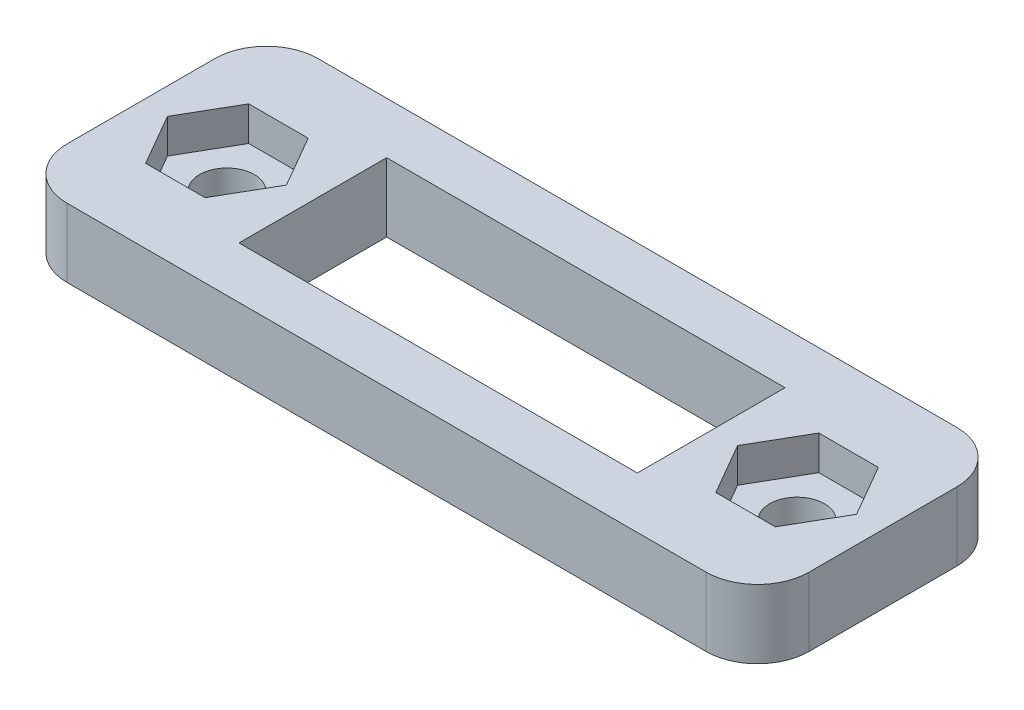
ISO-10303-21;
HEADER;
FILE_DESCRIPTION(('STEP AP214'),'2;1');
FILE_NAME('part.step','',(''),(''),'','','');
FILE_SCHEMA(('AUTOMOTIVE_DESIGN { 1 0 10303 214 1 1 1 1 }'));
ENDSEC;
DATA;
#1=APPLICATION_CONTEXT('core data for automotive mechanical design processes');
#2=APPLICATION_PROTOCOL_DEFINITION('international standard','automotive_design',2000,#1);
#3=PRODUCT_CONTEXT('',#1,'mechanical');
#4=PRODUCT('Part','Part','',(#3));
#5=PRODUCT_RELATED_PRODUCT_CATEGORY('part','',(#4));
#6=PRODUCT_DEFINITION_FORMATION('','',#4);
#7=PRODUCT_DEFINITION_CONTEXT('part definition',#1,'design');
#8=PRODUCT_DEFINITION('design','',#6,#7);
#9=PRODUCT_DEFINITION_SHAPE('','',#8);
#10=(LENGTH_UNIT() NAMED_UNIT(*) SI_UNIT(.MILLI.,.METRE.));
#11=(NAMED_UNIT(*) PLANE_ANGLE_UNIT() SI_UNIT($,.RADIAN.));
#12=(NAMED_UNIT(*) SI_UNIT($,.STERADIAN.) SOLID_ANGLE_UNIT());
#13=UNCERTAINTY_MEASURE_WITH_UNIT(LENGTH_MEASURE(1.E-05),#10,'distance_accuracy_value','');
#14=(GEOMETRIC_REPRESENTATION_CONTEXT(3) GLOBAL_UNCERTAINTY_ASSIGNED_CONTEXT((#13)) GLOBAL_UNIT_ASSIGNED_CONTEXT((#10,
#11,#12)) REPRESENTATION_CONTEXT('',''));
#15=CARTESIAN_POINT('',(0.,0.,0.));
#16=DIRECTION('',(0.,0.,1.));
#17=DIRECTION('',(1.,0.,0.));
#18=AXIS2_PLACEMENT_3D('',#15,#16,#17);
#19=CARTESIAN_POINT('',(0.,4.,0.));
#20=DIRECTION('',(0.,1.,0.));
#21=DIRECTION('',(0.,0.,1.));
#22=AXIS2_PLACEMENT_3D('',#19,#20,#21);
#23=PLANE('',#22);
#24=DIRECTION('',(0.500000000000002,0.,-0.866025403784438));
#25=VECTOR('',#24,1.);
#26=CARTESIAN_POINT('',(-13.1358983848622,4.,0.));
#27=LINE('',#26,#25);
#28=CARTESIAN_POINT('',(-14.8679491924311,4.,2.99999999999997));
#29=VERTEX_POINT('',#28);
#30=CARTESIAN_POINT('',(-13.1358983848622,4.,0.));
#31=VERTEX_POINT('',#30);
#32=EDGE_CURVE('E209',#29,#31,#27,.T.);
#33=ORIENTED_EDGE('',*,*,#32,.F.);
#34=DIRECTION('',(1.,0.,0.));
#35=VECTOR('',#34,1.);
#36=CARTESIAN_POINT('',(-14.8679491924311,4.,2.99999999999997));
#37=LINE('',#36,#35);
#38=CARTESIAN_POINT('',(-18.3320508075689,4.,2.99999999999997));
#39=VERTEX_POINT('',#38);
#40=EDGE_CURVE('E230',#39,#29,#37,.T.);
#41=ORIENTED_EDGE('',*,*,#40,.F.);
#42=DIRECTION('',(0.499999999999999,0.,0.866025403784439));
#43=VECTOR('',#42,1.);
#44=CARTESIAN_POINT('',(-18.3320508075689,4.,2.99999999999997));
#45=LINE('',#44,#43);
#46=CARTESIAN_POINT('',(-20.0641016151378,4.,0.));
#47=VERTEX_POINT('',#46);
#48=EDGE_CURVE('E234',#47,#39,#45,.T.);
#49=ORIENTED_EDGE('',*,*,#48,.F.);
#50=DIRECTION('',(-0.500000000000002,0.,0.866025403784438));
#51=VECTOR('',#50,1.);
#52=CARTESIAN_POINT('',(-20.0641016151378,4.,0.));
#53=LINE('',#52,#51);
#54=CARTESIAN_POINT('',(-18.3320508075689,4.,-3.00000000000003));
#55=VERTEX_POINT('',#54);
#56=EDGE_CURVE('E261',#55,#47,#53,.T.);
#57=ORIENTED_EDGE('',*,*,#56,.F.);
#58=DIRECTION('',(-1.,0.,0.));
#59=VECTOR('',#58,1.);
#60=CARTESIAN_POINT('',(-18.3320508075689,4.,-3.00000000000003));
#61=LINE('',#60,#59);
#62=CARTESIAN_POINT('',(-14.8679491924311,4.,-3.00000000000003));
#63=VERTEX_POINT('',#62);
#64=EDGE_CURVE('E257',#63,#55,#61,.T.);
#65=ORIENTED_EDGE('',*,*,#64,.F.);
#66=DIRECTION('',(-0.499999999999998,0.,-0.86602540378444));
#67=VECTOR('',#66,1.);
#68=CARTESIAN_POINT('',(-14.8679491924311,4.,-3.00000000000003));
#69=LINE('',#68,#67);
#70=EDGE_CURVE('E253',#31,#63,#69,.T.);
#71=ORIENTED_EDGE('',*,*,#70,.F.);
#72=EDGE_LOOP('',(#33,#41,#49,#57,#65,#71));
#73=FACE_BOUND('',#72,.T.);
#74=DIRECTION('',(1.,0.,0.));
#75=VECTOR('',#74,1.);
#76=CARTESIAN_POINT('',(14.8679491924311,4.,3.));
#77=LINE('',#76,#75);
#78=CARTESIAN_POINT('',(14.8679491924311,4.,3.));
#79=VERTEX_POINT('',#78);
#80=CARTESIAN_POINT('',(18.3320508075689,4.,3.));
#81=VERTEX_POINT('',#80);
#82=EDGE_CURVE('E309',#79,#81,#77,.T.);
#83=ORIENTED_EDGE('',*,*,#82,.F.);
#84=DIRECTION('',(0.5,0.,0.866025403784439));
#85=VECTOR('',#84,1.);
#86=CARTESIAN_POINT('',(13.1358983848622,4.,0.));
#87=LINE('',#86,#85);
#88=CARTESIAN_POINT('',(13.1358983848622,4.,0.));
#89=VERTEX_POINT('',#88);
#90=EDGE_CURVE('E288',#89,#79,#87,.T.);
#91=ORIENTED_EDGE('',*,*,#90,.F.);
#92=DIRECTION('',(-0.5,0.,0.866025403784439));
#93=VECTOR('',#92,1.);
#94=CARTESIAN_POINT('',(14.8679491924311,4.,-3.));
#95=LINE('',#94,#93);
#96=CARTESIAN_POINT('',(14.8679491924311,4.,-3.));
#97=VERTEX_POINT('',#96);
#98=EDGE_CURVE('E325',#97,#89,#95,.T.);
#99=ORIENTED_EDGE('',*,*,#98,.F.);
#100=DIRECTION('',(-1.,0.,0.));
#101=VECTOR('',#100,1.);
#102=CARTESIAN_POINT('',(18.3320508075689,4.,-3.));
#103=LINE('',#102,#101);
#104=CARTESIAN_POINT('',(18.3320508075689,4.,-3.));
#105=VERTEX_POINT('',#104);
#106=EDGE_CURVE('E321',#105,#97,#103,.T.);
#107=ORIENTED_EDGE('',*,*,#106,.F.);
#108=DIRECTION('',(-0.5,0.,-0.866025403784439));
#109=VECTOR('',#108,1.);
#110=CARTESIAN_POINT('',(20.0641016151378,4.,0.));
#111=LINE('',#110,#109);
#112=CARTESIAN_POINT('',(20.0641016151378,4.,0.));
#113=VERTEX_POINT('',#112);
#114=EDGE_CURVE('E317',#113,#105,#111,.T.);
#115=ORIENTED_EDGE('',*,*,#114,.F.);
#116=DIRECTION('',(0.500000000000001,0.,-0.866025403784438));
#117=VECTOR('',#116,1.);
#118=CARTESIAN_POINT('',(18.3320508075689,4.,3.));
#119=LINE('',#118,#117);
#120=EDGE_CURVE('E312',#81,#113,#119,.T.);
#121=ORIENTED_EDGE('',*,*,#120,.F.);
#122=EDGE_LOOP('',(#83,#91,#99,#107,#115,#121));
#123=FACE_BOUND('',#122,.T.);
#124=DIRECTION('',(0.,0.,-1.));
#125=VECTOR('',#124,1.);
#126=CARTESIAN_POINT('',(21.6,4.,-7.3));
#127=LINE('',#126,#125);
#128=CARTESIAN_POINT('',(21.6,4.,4.3));
#129=VERTEX_POINT('',#128);
#130=CARTESIAN_POINT('',(21.6,4.,-4.3));
#131=VERTEX_POINT('',#130);
#132=EDGE_CURVE('E399',#129,#131,#127,.T.);
#133=ORIENTED_EDGE('',*,*,#132,.T.);
#134=CARTESIAN_POINT('',(18.6,4.,-4.3));
#135=DIRECTION('',(0.,1.,0.));
#136=DIRECTION('',(0.,0.,1.));
#137=AXIS2_PLACEMENT_3D('',#134,#135,#136);
#138=CIRCLE('',#137,3.);
#139=CARTESIAN_POINT('',(18.6,4.,-7.3));
#140=VERTEX_POINT('',#139);
#141=EDGE_CURVE('E454',#131,#140,#138,.T.);
#142=ORIENTED_EDGE('',*,*,#141,.T.);
#143=DIRECTION('',(-1.,0.,0.));
#144=VECTOR('',#143,1.);
#145=CARTESIAN_POINT('',(-21.6,4.,-7.3));
#146=LINE('',#145,#144);
#147=CARTESIAN_POINT('',(-18.6,4.,-7.3));
#148=VERTEX_POINT('',#147);
#149=EDGE_CURVE('E403',#140,#148,#146,.T.);
#150=ORIENTED_EDGE('',*,*,#149,.T.);
#151=CARTESIAN_POINT('',(-18.6,4.,-4.3));
#152=DIRECTION('',(0.,1.,0.));
#153=DIRECTION('',(0.,0.,1.));
#154=AXIS2_PLACEMENT_3D('',#151,#152,#153);
#155=CIRCLE('',#154,3.);
#156=CARTESIAN_POINT('',(-21.6,4.,-4.3));
#157=VERTEX_POINT('',#156);
#158=EDGE_CURVE('E451',#148,#157,#155,.T.);
#159=ORIENTED_EDGE('',*,*,#158,.T.);
#160=DIRECTION('',(0.,0.,1.));
#161=VECTOR('',#160,1.);
#162=CARTESIAN_POINT('',(-21.6,4.,-7.3));
#163=LINE('',#162,#161);
#164=CARTESIAN_POINT('',(-21.6,4.,4.3));
#165=VERTEX_POINT('',#164);
#166=EDGE_CURVE('E392',#157,#165,#163,.T.);
#167=ORIENTED_EDGE('',*,*,#166,.T.);
#168=CARTESIAN_POINT('',(-18.6,4.,4.3));
#169=DIRECTION('',(0.,1.,0.));
#170=DIRECTION('',(0.,0.,1.));
#171=AXIS2_PLACEMENT_3D('',#168,#169,#170);
#172=CIRCLE('',#171,3.);
#173=CARTESIAN_POINT('',(-18.6,4.,7.3));
#174=VERTEX_POINT('',#173);
#175=EDGE_CURVE('E61',#165,#174,#172,.T.);
#176=ORIENTED_EDGE('',*,*,#175,.T.);
#177=DIRECTION('',(1.,0.,0.));
#178=VECTOR('',#177,1.);
#179=CARTESIAN_POINT('',(-21.6,4.,7.3));
#180=LINE('',#179,#178);
#181=CARTESIAN_POINT('',(18.6,4.,7.3));
#182=VERTEX_POINT('',#181);
#183=EDGE_CURVE('E395',#174,#182,#180,.T.);
#184=ORIENTED_EDGE('',*,*,#183,.T.);
#185=CARTESIAN_POINT('',(18.6,4.,4.3));
#186=DIRECTION('',(0.,1.,0.));
#187=DIRECTION('',(0.,0.,1.));
#188=AXIS2_PLACEMENT_3D('',#185,#186,#187);
#189=CIRCLE('',#188,3.);
#190=EDGE_CURVE('E446',#182,#129,#189,.T.);
#191=ORIENTED_EDGE('',*,*,#190,.T.);
#192=EDGE_LOOP('',(#133,#142,#150,#159,#167,#176,#184,#191));
#193=FACE_BOUND('',#192,.T.);
#194=DIRECTION('',(1.,0.,0.));
#195=VECTOR('',#194,1.);
#196=CARTESIAN_POINT('',(-11.6,4.,4.3));
#197=LINE('',#196,#195);
#198=CARTESIAN_POINT('',(-11.6,4.,4.3));
#199=VERTEX_POINT('',#198);
#200=CARTESIAN_POINT('',(11.6,4.,4.3));
#201=VERTEX_POINT('',#200);
#202=EDGE_CURVE('E352',#199,#201,#197,.T.);
#203=ORIENTED_EDGE('',*,*,#202,.F.);
#204=DIRECTION('',(0.,0.,1.));
#205=VECTOR('',#204,1.);
#206=CARTESIAN_POINT('',(-11.6,4.,-4.3));
#207=LINE('',#206,#205);
#208=CARTESIAN_POINT('',(-11.6,4.,-4.3));
#209=VERTEX_POINT('',#208);
#210=EDGE_CURVE('E349',#209,#199,#207,.T.);
#211=ORIENTED_EDGE('',*,*,#210,.F.);
#212=DIRECTION('',(-1.,0.,0.));
#213=VECTOR('',#212,1.);
#214=CARTESIAN_POINT('',(-11.6,4.,-4.3));
#215=LINE('',#214,#213);
#216=CARTESIAN_POINT('',(11.6,4.,-4.3));
#217=VERTEX_POINT('',#216);
#218=EDGE_CURVE('E360',#217,#209,#215,.T.);
#219=ORIENTED_EDGE('',*,*,#218,.F.);
#220=DIRECTION('',(0.,0.,-1.));
#221=VECTOR('',#220,1.);
#222=CARTESIAN_POINT('',(11.6,4.,-4.3));
#223=LINE('',#222,#221);
#224=EDGE_CURVE('E356',#201,#217,#223,.T.);
#225=ORIENTED_EDGE('',*,*,#224,.F.);
#226=EDGE_LOOP('',(#203,#211,#219,#225));
#227=FACE_BOUND('',#226,.T.);
#228=ADVANCED_FACE('F39',(#73,#123,#193,#227),#23,.T.);
#229=CARTESIAN_POINT('',(0.,0.,0.));
#230=DIRECTION('',(0.,1.,0.));
#231=DIRECTION('',(0.,0.,1.));
#232=AXIS2_PLACEMENT_3D('',#229,#230,#231);
#233=PLANE('',#232);
#234=CARTESIAN_POINT('',(-16.6,0.,0.));
#235=DIRECTION('',(0.,1.,0.));
#236=DIRECTION('',(0.,0.,1.));
#237=AXIS2_PLACEMENT_3D('',#234,#235,#236);
#238=CIRCLE('',#237,1.6);
#239=CARTESIAN_POINT('',(-16.6,0.,1.6));
#240=VERTEX_POINT('',#239);
#241=EDGE_CURVE('E313',#240,#240,#238,.T.);
#242=ORIENTED_EDGE('',*,*,#241,.T.);
#243=EDGE_LOOP('',(#242));
#244=FACE_BOUND('',#243,.T.);
#245=CARTESIAN_POINT('',(16.6,0.,0.));
#246=DIRECTION('',(0.,1.,0.));
#247=DIRECTION('',(0.,0.,-1.));
#248=AXIS2_PLACEMENT_3D('',#245,#246,#247);
#249=CIRCLE('',#248,1.6);
#250=CARTESIAN_POINT('',(16.6,0.,-1.6));
#251=VERTEX_POINT('',#250);
#252=EDGE_CURVE('E782',#251,#251,#249,.T.);
#253=ORIENTED_EDGE('',*,*,#252,.T.);
#254=EDGE_LOOP('',(#253));
#255=FACE_BOUND('',#254,.T.);
#256=DIRECTION('',(-1.,0.,0.));
#257=VECTOR('',#256,1.);
#258=CARTESIAN_POINT('',(-21.6,0.,-7.3));
#259=LINE('',#258,#257);
#260=CARTESIAN_POINT('',(18.6,0.,-7.3));
#261=VERTEX_POINT('',#260);
#262=CARTESIAN_POINT('',(-18.6,0.,-7.3));
#263=VERTEX_POINT('',#262);
#264=EDGE_CURVE('E396',#261,#263,#259,.T.);
#265=ORIENTED_EDGE('',*,*,#264,.F.);
#266=CARTESIAN_POINT('',(18.6,0.,-4.3));
#267=DIRECTION('',(0.,1.,0.));
#268=DIRECTION('',(0.,0.,1.));
#269=AXIS2_PLACEMENT_3D('',#266,#267,#268);
#270=CIRCLE('',#269,3.);
#271=CARTESIAN_POINT('',(21.6,0.,-4.3));
#272=VERTEX_POINT('',#271);
#273=EDGE_CURVE('E436',#261,#272,#270,.F.);
#274=ORIENTED_EDGE('',*,*,#273,.T.);
#275=DIRECTION('',(0.,0.,-1.));
#276=VECTOR('',#275,1.);
#277=CARTESIAN_POINT('',(21.6,0.,-7.3));
#278=LINE('',#277,#276);
#279=CARTESIAN_POINT('',(21.6,0.,4.3));
#280=VERTEX_POINT('',#279);
#281=EDGE_CURVE('E414',#280,#272,#278,.T.);
#282=ORIENTED_EDGE('',*,*,#281,.F.);
#283=CARTESIAN_POINT('',(18.6,0.,4.3));
#284=DIRECTION('',(0.,1.,0.));
#285=DIRECTION('',(0.,0.,1.));
#286=AXIS2_PLACEMENT_3D('',#283,#284,#285);
#287=CIRCLE('',#286,3.);
#288=CARTESIAN_POINT('',(18.6,0.,7.3));
#289=VERTEX_POINT('',#288);
#290=EDGE_CURVE('E427',#280,#289,#287,.F.);
#291=ORIENTED_EDGE('',*,*,#290,.T.);
#292=DIRECTION('',(1.,0.,0.));
#293=VECTOR('',#292,1.);
#294=CARTESIAN_POINT('',(-21.6,0.,7.3));
#295=LINE('',#294,#293);
#296=CARTESIAN_POINT('',(-18.6,0.,7.3));
#297=VERTEX_POINT('',#296);
#298=EDGE_CURVE('E411',#297,#289,#295,.T.);
#299=ORIENTED_EDGE('',*,*,#298,.F.);
#300=CARTESIAN_POINT('',(-18.6,0.,4.3));
#301=DIRECTION('',(0.,1.,0.));
#302=DIRECTION('',(0.,0.,1.));
#303=AXIS2_PLACEMENT_3D('',#300,#301,#302);
#304=CIRCLE('',#303,3.);
#305=CARTESIAN_POINT('',(-21.6,0.,4.3));
#306=VERTEX_POINT('',#305);
#307=EDGE_CURVE('E430',#297,#306,#304,.F.);
#308=ORIENTED_EDGE('',*,*,#307,.T.);
#309=DIRECTION('',(0.,0.,1.));
#310=VECTOR('',#309,1.);
#311=CARTESIAN_POINT('',(-21.6,0.,-7.3));
#312=LINE('',#311,#310);
#313=CARTESIAN_POINT('',(-21.6,0.,-4.3));
#314=VERTEX_POINT('',#313);
#315=EDGE_CURVE('E391',#314,#306,#312,.T.);
#316=ORIENTED_EDGE('',*,*,#315,.F.);
#317=CARTESIAN_POINT('',(-18.6,0.,-4.3));
#318=DIRECTION('',(0.,1.,0.));
#319=DIRECTION('',(0.,0.,1.));
#320=AXIS2_PLACEMENT_3D('',#317,#318,#319);
#321=CIRCLE('',#320,3.);
#322=EDGE_CURVE('E433',#314,#263,#321,.F.);
#323=ORIENTED_EDGE('',*,*,#322,.T.);
#324=EDGE_LOOP('',(#265,#274,#282,#291,#299,#308,#316,#323));
#325=FACE_BOUND('',#324,.T.);
#326=DIRECTION('',(0.,0.,1.));
#327=VECTOR('',#326,1.);
#328=CARTESIAN_POINT('',(-11.6,0.,-4.3));
#329=LINE('',#328,#327);
#330=CARTESIAN_POINT('',(-11.6,0.,-4.3));
#331=VERTEX_POINT('',#330);
#332=CARTESIAN_POINT('',(-11.6,0.,4.3));
#333=VERTEX_POINT('',#332);
#334=EDGE_CURVE('E271',#331,#333,#329,.T.);
#335=ORIENTED_EDGE('',*,*,#334,.T.);
#336=DIRECTION('',(1.,0.,0.));
#337=VECTOR('',#336,1.);
#338=CARTESIAN_POINT('',(-11.6,0.,4.3));
#339=LINE('',#338,#337);
#340=CARTESIAN_POINT('',(11.6,0.,4.3));
#341=VERTEX_POINT('',#340);
#342=EDGE_CURVE('E367',#333,#341,#339,.T.);
#343=ORIENTED_EDGE('',*,*,#342,.T.);
#344=DIRECTION('',(0.,0.,-1.));
#345=VECTOR('',#344,1.);
#346=CARTESIAN_POINT('',(11.6,0.,-4.3));
#347=LINE('',#346,#345);
#348=CARTESIAN_POINT('',(11.6,0.,-4.3));
#349=VERTEX_POINT('',#348);
#350=EDGE_CURVE('E371',#341,#349,#347,.T.);
#351=ORIENTED_EDGE('',*,*,#350,.T.);
#352=DIRECTION('',(-1.,0.,0.));
#353=VECTOR('',#352,1.);
#354=CARTESIAN_POINT('',(-11.6,0.,-4.3));
#355=LINE('',#354,#353);
#356=EDGE_CURVE('E353',#349,#331,#355,.T.);
#357=ORIENTED_EDGE('',*,*,#356,.T.);
#358=EDGE_LOOP('',(#335,#343,#351,#357));
#359=FACE_BOUND('',#358,.T.);
#360=ADVANCED_FACE('F474',(#244,#255,#325,#359),#233,.F.);
#361=CARTESIAN_POINT('',(-21.6,4.,-7.3));
#362=DIRECTION('',(1.,0.,0.));
#363=DIRECTION('',(0.,0.,-1.));
#364=AXIS2_PLACEMENT_3D('',#361,#362,#363);
#365=PLANE('',#364);
#366=ORIENTED_EDGE('',*,*,#166,.F.);
#367=DIRECTION('',(0.,-1.,0.));
#368=VECTOR('',#367,1.);
#369=CARTESIAN_POINT('',(-21.6,4.,-4.3));
#370=LINE('',#369,#368);
#371=EDGE_CURVE('E460',#157,#314,#370,.T.);
#372=ORIENTED_EDGE('',*,*,#371,.T.);
#373=ORIENTED_EDGE('',*,*,#315,.T.);
#374=DIRECTION('',(0.,-1.,0.));
#375=VECTOR('',#374,1.);
#376=CARTESIAN_POINT('',(-21.6,4.,4.3));
#377=LINE('',#376,#375);
#378=EDGE_CURVE('E457',#306,#165,#377,.F.);
#379=ORIENTED_EDGE('',*,*,#378,.T.);
#380=EDGE_LOOP('',(#366,#372,#373,#379));
#381=FACE_BOUND('',#380,.T.);
#382=ADVANCED_FACE('F468',(#381),#365,.F.);
#383=CARTESIAN_POINT('',(-21.6,4.,7.3));
#384=DIRECTION('',(0.,0.,-1.));
#385=DIRECTION('',(-1.,0.,0.));
#386=AXIS2_PLACEMENT_3D('',#383,#384,#385);
#387=PLANE('',#386);
#388=ORIENTED_EDGE('',*,*,#183,.F.);
#389=DIRECTION('',(0.,-1.,0.));
#390=VECTOR('',#389,1.);
#391=CARTESIAN_POINT('',(-18.6,4.,7.3));
#392=LINE('',#391,#390);
#393=EDGE_CURVE('E11',#174,#297,#392,.T.);
#394=ORIENTED_EDGE('',*,*,#393,.T.);
#395=ORIENTED_EDGE('',*,*,#298,.T.);
#396=DIRECTION('',(0.,-1.,0.));
#397=VECTOR('',#396,1.);
#398=CARTESIAN_POINT('',(18.6,4.,7.3));
#399=LINE('',#398,#397);
#400=EDGE_CURVE('E48',#289,#182,#399,.F.);
#401=ORIENTED_EDGE('',*,*,#400,.T.);
#402=EDGE_LOOP('',(#388,#394,#395,#401));
#403=FACE_BOUND('',#402,.T.);
#404=ADVANCED_FACE('F480',(#403),#387,.F.);
#405=CARTESIAN_POINT('',(21.6,4.,-7.3));
#406=DIRECTION('',(-1.,0.,0.));
#407=DIRECTION('',(0.,0.,1.));
#408=AXIS2_PLACEMENT_3D('',#405,#406,#407);
#409=PLANE('',#408);
#410=ORIENTED_EDGE('',*,*,#281,.T.);
#411=DIRECTION('',(0.,-1.,0.));
#412=VECTOR('',#411,1.);
#413=CARTESIAN_POINT('',(21.6,4.,-4.3));
#414=LINE('',#413,#412);
#415=EDGE_CURVE('E443',#272,#131,#414,.F.);
#416=ORIENTED_EDGE('',*,*,#415,.T.);
#417=ORIENTED_EDGE('',*,*,#132,.F.);
#418=DIRECTION('',(0.,-1.,0.));
#419=VECTOR('',#418,1.);
#420=CARTESIAN_POINT('',(21.6,4.,4.3));
#421=LINE('',#420,#419);
#422=EDGE_CURVE('E439',#129,#280,#421,.T.);
#423=ORIENTED_EDGE('',*,*,#422,.T.);
#424=EDGE_LOOP('',(#410,#416,#417,#423));
#425=FACE_BOUND('',#424,.T.);
#426=ADVANCED_FACE('F488',(#425),#409,.F.);
#427=CARTESIAN_POINT('',(-21.6,4.,-7.3));
#428=DIRECTION('',(0.,0.,1.));
#429=DIRECTION('',(1.,0.,0.));
#430=AXIS2_PLACEMENT_3D('',#427,#428,#429);
#431=PLANE('',#430);
#432=ORIENTED_EDGE('',*,*,#149,.F.);
#433=DIRECTION('',(0.,-1.,0.));
#434=VECTOR('',#433,1.);
#435=CARTESIAN_POINT('',(18.6,4.,-7.3));
#436=LINE('',#435,#434);
#437=EDGE_CURVE('E423',#140,#261,#436,.T.);
#438=ORIENTED_EDGE('',*,*,#437,.T.);
#439=ORIENTED_EDGE('',*,*,#264,.T.);
#440=DIRECTION('',(0.,-1.,0.));
#441=VECTOR('',#440,1.);
#442=CARTESIAN_POINT('',(-18.6,4.,-7.3));
#443=LINE('',#442,#441);
#444=EDGE_CURVE('E407',#263,#148,#443,.F.);
#445=ORIENTED_EDGE('',*,*,#444,.T.);
#446=EDGE_LOOP('',(#432,#438,#439,#445));
#447=FACE_BOUND('',#446,.T.);
#448=ADVANCED_FACE('F496',(#447),#431,.F.);
#449=CARTESIAN_POINT('',(-11.6,4.,-4.3));
#450=DIRECTION('',(1.,0.,0.));
#451=DIRECTION('',(0.,0.,-1.));
#452=AXIS2_PLACEMENT_3D('',#449,#450,#451);
#453=PLANE('',#452);
#454=ORIENTED_EDGE('',*,*,#334,.F.);
#455=DIRECTION('',(0.,-1.,0.));
#456=VECTOR('',#455,1.);
#457=CARTESIAN_POINT('',(-11.6,4.,-4.3));
#458=LINE('',#457,#456);
#459=EDGE_CURVE('E363',#209,#331,#458,.T.);
#460=ORIENTED_EDGE('',*,*,#459,.F.);
#461=ORIENTED_EDGE('',*,*,#210,.T.);
#462=DIRECTION('',(0.,-1.,0.));
#463=VECTOR('',#462,1.);
#464=CARTESIAN_POINT('',(-11.6,4.,4.3));
#465=LINE('',#464,#463);
#466=EDGE_CURVE('E387',#199,#333,#465,.T.);
#467=ORIENTED_EDGE('',*,*,#466,.T.);
#468=EDGE_LOOP('',(#454,#460,#461,#467));
#469=FACE_BOUND('',#468,.T.);
#470=ADVANCED_FACE('F517',(#469),#453,.T.);
#471=CARTESIAN_POINT('',(-11.6,4.,4.3));
#472=DIRECTION('',(0.,0.,-1.));
#473=DIRECTION('',(-1.,0.,0.));
#474=AXIS2_PLACEMENT_3D('',#471,#472,#473);
#475=PLANE('',#474);
#476=ORIENTED_EDGE('',*,*,#342,.F.);
#477=ORIENTED_EDGE('',*,*,#466,.F.);
#478=ORIENTED_EDGE('',*,*,#202,.T.);
#479=DIRECTION('',(0.,-1.,0.));
#480=VECTOR('',#479,1.);
#481=CARTESIAN_POINT('',(11.6,4.,4.3));
#482=LINE('',#481,#480);
#483=EDGE_CURVE('E384',#201,#341,#482,.T.);
#484=ORIENTED_EDGE('',*,*,#483,.T.);
#485=EDGE_LOOP('',(#476,#477,#478,#484));
#486=FACE_BOUND('',#485,.T.);
#487=ADVANCED_FACE('F550',(#486),#475,.T.);
#488=CARTESIAN_POINT('',(11.6,4.,-4.3));
#489=DIRECTION('',(-1.,0.,0.));
#490=DIRECTION('',(0.,0.,1.));
#491=AXIS2_PLACEMENT_3D('',#488,#489,#490);
#492=PLANE('',#491);
#493=ORIENTED_EDGE('',*,*,#350,.F.);
#494=ORIENTED_EDGE('',*,*,#483,.F.);
#495=ORIENTED_EDGE('',*,*,#224,.T.);
#496=DIRECTION('',(0.,-1.,0.));
#497=VECTOR('',#496,1.);
#498=CARTESIAN_POINT('',(11.6,4.,-4.3));
#499=LINE('',#498,#497);
#500=EDGE_CURVE('E381',#217,#349,#499,.T.);
#501=ORIENTED_EDGE('',*,*,#500,.T.);
#502=EDGE_LOOP('',(#493,#494,#495,#501));
#503=FACE_BOUND('',#502,.T.);
#504=ADVANCED_FACE('F557',(#503),#492,.T.);
#505=CARTESIAN_POINT('',(-11.6,4.,-4.3));
#506=DIRECTION('',(0.,0.,1.));
#507=DIRECTION('',(1.,0.,0.));
#508=AXIS2_PLACEMENT_3D('',#505,#506,#507);
#509=PLANE('',#508);
#510=ORIENTED_EDGE('',*,*,#356,.F.);
#511=ORIENTED_EDGE('',*,*,#500,.F.);
#512=ORIENTED_EDGE('',*,*,#218,.T.);
#513=ORIENTED_EDGE('',*,*,#459,.T.);
#514=EDGE_LOOP('',(#510,#511,#512,#513));
#515=FACE_BOUND('',#514,.T.);
#516=ADVANCED_FACE('F564',(#515),#509,.T.);
#517=CARTESIAN_POINT('',(14.8679491924311,2.,3.));
#518=DIRECTION('',(0.,0.,1.));
#519=DIRECTION('',(1.,0.,0.));
#520=AXIS2_PLACEMENT_3D('',#517,#518,#519);
#521=PLANE('',#520);
#522=ORIENTED_EDGE('',*,*,#82,.T.);
#523=DIRECTION('',(0.,1.,0.));
#524=VECTOR('',#523,1.);
#525=CARTESIAN_POINT('',(18.3320508075689,2.,3.));
#526=LINE('',#525,#524);
#527=CARTESIAN_POINT('',(18.3320508075689,2.,3.));
#528=VERTEX_POINT('',#527);
#529=EDGE_CURVE('E308',#528,#81,#526,.T.);
#530=ORIENTED_EDGE('',*,*,#529,.F.);
#531=DIRECTION('',(1.,0.,0.));
#532=VECTOR('',#531,1.);
#533=CARTESIAN_POINT('',(14.8679491924311,2.,3.));
#534=LINE('',#533,#532);
#535=CARTESIAN_POINT('',(14.8679491924311,2.,3.));
#536=VERTEX_POINT('',#535);
#537=EDGE_CURVE('E283',#536,#528,#534,.T.);
#538=ORIENTED_EDGE('',*,*,#537,.F.);
#539=DIRECTION('',(0.,1.,0.));
#540=VECTOR('',#539,1.);
#541=CARTESIAN_POINT('',(14.8679491924311,2.,3.));
#542=LINE('',#541,#540);
#543=EDGE_CURVE('E254',#536,#79,#542,.T.);
#544=ORIENTED_EDGE('',*,*,#543,.T.);
#545=EDGE_LOOP('',(#522,#530,#538,#544));
#546=FACE_BOUND('',#545,.T.);
#547=ADVANCED_FACE('F572',(#546),#521,.F.);
#548=CARTESIAN_POINT('',(13.1358983848622,2.,0.));
#549=DIRECTION('',(-0.866025403784439,0.,0.5));
#550=DIRECTION('',(0.5,0.,0.866025403784439));
#551=AXIS2_PLACEMENT_3D('',#548,#549,#550);
#552=PLANE('',#551);
#553=ORIENTED_EDGE('',*,*,#90,.T.);
#554=ORIENTED_EDGE('',*,*,#543,.F.);
#555=DIRECTION('',(0.5,0.,0.866025403784439));
#556=VECTOR('',#555,1.);
#557=CARTESIAN_POINT('',(13.1358983848622,2.,0.));
#558=LINE('',#557,#556);
#559=CARTESIAN_POINT('',(13.1358983848622,2.,0.));
#560=VERTEX_POINT('',#559);
#561=EDGE_CURVE('E304',#560,#536,#558,.T.);
#562=ORIENTED_EDGE('',*,*,#561,.F.);
#563=DIRECTION('',(0.,1.,0.));
#564=VECTOR('',#563,1.);
#565=CARTESIAN_POINT('',(13.1358983848622,2.,0.));
#566=LINE('',#565,#564);
#567=EDGE_CURVE('E334',#560,#89,#566,.T.);
#568=ORIENTED_EDGE('',*,*,#567,.T.);
#569=EDGE_LOOP('',(#553,#554,#562,#568));
#570=FACE_BOUND('',#569,.T.);
#571=ADVANCED_FACE('F580',(#570),#552,.F.);
#572=CARTESIAN_POINT('',(14.8679491924311,2.,-3.));
#573=DIRECTION('',(-0.866025403784439,0.,-0.5));
#574=DIRECTION('',(-0.5,0.,0.866025403784439));
#575=AXIS2_PLACEMENT_3D('',#572,#573,#574);
#576=PLANE('',#575);
#577=ORIENTED_EDGE('',*,*,#98,.T.);
#578=ORIENTED_EDGE('',*,*,#567,.F.);
#579=DIRECTION('',(-0.5,0.,0.866025403784439));
#580=VECTOR('',#579,1.);
#581=CARTESIAN_POINT('',(14.8679491924311,2.,-3.));
#582=LINE('',#581,#580);
#583=CARTESIAN_POINT('',(14.8679491924311,2.,-3.));
#584=VERTEX_POINT('',#583);
#585=EDGE_CURVE('E300',#584,#560,#582,.T.);
#586=ORIENTED_EDGE('',*,*,#585,.F.);
#587=DIRECTION('',(0.,1.,0.));
#588=VECTOR('',#587,1.);
#589=CARTESIAN_POINT('',(14.8679491924311,2.,-3.));
#590=LINE('',#589,#588);
#591=EDGE_CURVE('E337',#584,#97,#590,.T.);
#592=ORIENTED_EDGE('',*,*,#591,.T.);
#593=EDGE_LOOP('',(#577,#578,#586,#592));
#594=FACE_BOUND('',#593,.T.);
#595=ADVANCED_FACE('F588',(#594),#576,.F.);
#596=CARTESIAN_POINT('',(18.3320508075689,2.,-3.));
#597=DIRECTION('',(0.,0.,-1.));
#598=DIRECTION('',(-1.,0.,0.));
#599=AXIS2_PLACEMENT_3D('',#596,#597,#598);
#600=PLANE('',#599);
#601=ORIENTED_EDGE('',*,*,#106,.T.);
#602=ORIENTED_EDGE('',*,*,#591,.F.);
#603=DIRECTION('',(-1.,0.,0.));
#604=VECTOR('',#603,1.);
#605=CARTESIAN_POINT('',(18.3320508075689,2.,-3.));
#606=LINE('',#605,#604);
#607=CARTESIAN_POINT('',(18.3320508075689,2.,-3.));
#608=VERTEX_POINT('',#607);
#609=EDGE_CURVE('E296',#608,#584,#606,.T.);
#610=ORIENTED_EDGE('',*,*,#609,.F.);
#611=DIRECTION('',(0.,1.,0.));
#612=VECTOR('',#611,1.);
#613=CARTESIAN_POINT('',(18.3320508075689,2.,-3.));
#614=LINE('',#613,#612);
#615=EDGE_CURVE('E340',#608,#105,#614,.T.);
#616=ORIENTED_EDGE('',*,*,#615,.T.);
#617=EDGE_LOOP('',(#601,#602,#610,#616));
#618=FACE_BOUND('',#617,.T.);
#619=ADVANCED_FACE('F596',(#618),#600,.F.);
#620=CARTESIAN_POINT('',(20.0641016151378,2.,0.));
#621=DIRECTION('',(0.866025403784439,0.,-0.5));
#622=DIRECTION('',(-0.5,0.,-0.866025403784439));
#623=AXIS2_PLACEMENT_3D('',#620,#621,#622);
#624=PLANE('',#623);
#625=ORIENTED_EDGE('',*,*,#114,.T.);
#626=ORIENTED_EDGE('',*,*,#615,.F.);
#627=DIRECTION('',(-0.5,0.,-0.866025403784439));
#628=VECTOR('',#627,1.);
#629=CARTESIAN_POINT('',(20.0641016151378,2.,0.));
#630=LINE('',#629,#628);
#631=CARTESIAN_POINT('',(20.0641016151378,2.,0.));
#632=VERTEX_POINT('',#631);
#633=EDGE_CURVE('E292',#632,#608,#630,.T.);
#634=ORIENTED_EDGE('',*,*,#633,.F.);
#635=DIRECTION('',(0.,1.,0.));
#636=VECTOR('',#635,1.);
#637=CARTESIAN_POINT('',(20.0641016151378,2.,0.));
#638=LINE('',#637,#636);
#639=EDGE_CURVE('E343',#632,#113,#638,.T.);
#640=ORIENTED_EDGE('',*,*,#639,.T.);
#641=EDGE_LOOP('',(#625,#626,#634,#640));
#642=FACE_BOUND('',#641,.T.);
#643=ADVANCED_FACE('F604',(#642),#624,.F.);
#644=CARTESIAN_POINT('',(18.3320508075689,2.,3.));
#645=DIRECTION('',(0.866025403784438,0.,0.500000000000001));
#646=DIRECTION('',(0.500000000000001,0.,-0.866025403784438));
#647=AXIS2_PLACEMENT_3D('',#644,#645,#646);
#648=PLANE('',#647);
#649=ORIENTED_EDGE('',*,*,#120,.T.);
#650=ORIENTED_EDGE('',*,*,#639,.F.);
#651=DIRECTION('',(0.500000000000001,0.,-0.866025403784438));
#652=VECTOR('',#651,1.);
#653=CARTESIAN_POINT('',(18.3320508075689,2.,3.));
#654=LINE('',#653,#652);
#655=EDGE_CURVE('E287',#528,#632,#654,.T.);
#656=ORIENTED_EDGE('',*,*,#655,.F.);
#657=ORIENTED_EDGE('',*,*,#529,.T.);
#658=EDGE_LOOP('',(#649,#650,#656,#657));
#659=FACE_BOUND('',#658,.T.);
#660=ADVANCED_FACE('F612',(#659),#648,.F.);
#661=CARTESIAN_POINT('',(0.,2.,0.));
#662=DIRECTION('',(0.,1.,0.));
#663=DIRECTION('',(0.,0.,1.));
#664=AXIS2_PLACEMENT_3D('',#661,#662,#663);
#665=PLANE('',#664);
#666=CARTESIAN_POINT('',(16.6,2.,0.));
#667=DIRECTION('',(0.,1.,0.));
#668=DIRECTION('',(0.,0.,-1.));
#669=AXIS2_PLACEMENT_3D('',#666,#667,#668);
#670=CIRCLE('',#669,1.6);
#671=CARTESIAN_POINT('',(16.6,2.,-1.6));
#672=VERTEX_POINT('',#671);
#673=EDGE_CURVE('E237',#672,#672,#670,.T.);
#674=ORIENTED_EDGE('',*,*,#673,.F.);
#675=EDGE_LOOP('',(#674));
#676=FACE_BOUND('',#675,.T.);
#677=ORIENTED_EDGE('',*,*,#537,.T.);
#678=ORIENTED_EDGE('',*,*,#655,.T.);
#679=ORIENTED_EDGE('',*,*,#633,.T.);
#680=ORIENTED_EDGE('',*,*,#609,.T.);
#681=ORIENTED_EDGE('',*,*,#585,.T.);
#682=ORIENTED_EDGE('',*,*,#561,.T.);
#683=EDGE_LOOP('',(#677,#678,#679,#680,#681,#682));
#684=FACE_BOUND('',#683,.T.);
#685=ADVANCED_FACE('F620',(#676,#684),#665,.T.);
#686=CARTESIAN_POINT('',(-13.1358983848622,2.,0.));
#687=DIRECTION('',(0.866025403784438,0.,0.500000000000002));
#688=DIRECTION('',(0.500000000000002,0.,-0.866025403784438));
#689=AXIS2_PLACEMENT_3D('',#686,#687,#688);
#690=PLANE('',#689);
#691=ORIENTED_EDGE('',*,*,#32,.T.);
#692=DIRECTION('',(0.,1.,0.));
#693=VECTOR('',#692,1.);
#694=CARTESIAN_POINT('',(-13.1358983848622,2.,0.));
#695=LINE('',#694,#693);
#696=CARTESIAN_POINT('',(-13.1358983848622,2.,0.));
#697=VERTEX_POINT('',#696);
#698=EDGE_CURVE('E202',#697,#31,#695,.T.);
#699=ORIENTED_EDGE('',*,*,#698,.F.);
#700=DIRECTION('',(0.500000000000002,0.,-0.866025403784438));
#701=VECTOR('',#700,1.);
#702=CARTESIAN_POINT('',(-13.1358983848622,2.,0.));
#703=LINE('',#702,#701);
#704=CARTESIAN_POINT('',(-14.8679491924311,2.,2.99999999999997));
#705=VERTEX_POINT('',#704);
#706=EDGE_CURVE('E206',#705,#697,#703,.T.);
#707=ORIENTED_EDGE('',*,*,#706,.F.);
#708=DIRECTION('',(0.,1.,0.));
#709=VECTOR('',#708,1.);
#710=CARTESIAN_POINT('',(-14.8679491924311,2.,2.99999999999997));
#711=LINE('',#710,#709);
#712=EDGE_CURVE('E268',#705,#29,#711,.T.);
#713=ORIENTED_EDGE('',*,*,#712,.T.);
#714=EDGE_LOOP('',(#691,#699,#707,#713));
#715=FACE_BOUND('',#714,.T.);
#716=ADVANCED_FACE('F204',(#715),#690,.F.);
#717=CARTESIAN_POINT('',(-14.8679491924311,2.,2.99999999999997));
#718=DIRECTION('',(0.,0.,1.));
#719=DIRECTION('',(1.,0.,0.));
#720=AXIS2_PLACEMENT_3D('',#717,#718,#719);
#721=PLANE('',#720);
#722=ORIENTED_EDGE('',*,*,#40,.T.);
#723=ORIENTED_EDGE('',*,*,#712,.F.);
#724=DIRECTION('',(1.,0.,0.));
#725=VECTOR('',#724,1.);
#726=CARTESIAN_POINT('',(-14.8679491924311,2.,2.99999999999997));
#727=LINE('',#726,#725);
#728=CARTESIAN_POINT('',(-18.3320508075689,2.,2.99999999999997));
#729=VERTEX_POINT('',#728);
#730=EDGE_CURVE('E215',#729,#705,#727,.T.);
#731=ORIENTED_EDGE('',*,*,#730,.F.);
#732=DIRECTION('',(0.,1.,0.));
#733=VECTOR('',#732,1.);
#734=CARTESIAN_POINT('',(-18.3320508075689,2.,2.99999999999997));
#735=LINE('',#734,#733);
#736=EDGE_CURVE('E272',#729,#39,#735,.T.);
#737=ORIENTED_EDGE('',*,*,#736,.T.);
#738=EDGE_LOOP('',(#722,#723,#731,#737));
#739=FACE_BOUND('',#738,.T.);
#740=ADVANCED_FACE('F637',(#739),#721,.F.);
#741=CARTESIAN_POINT('',(-18.3320508075689,2.,2.99999999999997));
#742=DIRECTION('',(-0.866025403784439,0.,0.499999999999999));
#743=DIRECTION('',(0.499999999999999,0.,0.866025403784439));
#744=AXIS2_PLACEMENT_3D('',#741,#742,#743);
#745=PLANE('',#744);
#746=ORIENTED_EDGE('',*,*,#48,.T.);
#747=ORIENTED_EDGE('',*,*,#736,.F.);
#748=DIRECTION('',(0.499999999999999,0.,0.866025403784439));
#749=VECTOR('',#748,1.);
#750=CARTESIAN_POINT('',(-18.3320508075689,2.,2.99999999999997));
#751=LINE('',#750,#749);
#752=CARTESIAN_POINT('',(-20.0641016151378,2.,0.));
#753=VERTEX_POINT('',#752);
#754=EDGE_CURVE('E246',#753,#729,#751,.T.);
#755=ORIENTED_EDGE('',*,*,#754,.F.);
#756=DIRECTION('',(0.,1.,0.));
#757=VECTOR('',#756,1.);
#758=CARTESIAN_POINT('',(-20.0641016151378,2.,0.));
#759=LINE('',#758,#757);
#760=EDGE_CURVE('E275',#753,#47,#759,.T.);
#761=ORIENTED_EDGE('',*,*,#760,.T.);
#762=EDGE_LOOP('',(#746,#747,#755,#761));
#763=FACE_BOUND('',#762,.T.);
#764=ADVANCED_FACE('F644',(#763),#745,.F.);
#765=CARTESIAN_POINT('',(-20.0641016151378,2.,0.));
#766=DIRECTION('',(-0.866025403784438,0.,-0.500000000000002));
#767=DIRECTION('',(-0.500000000000002,0.,0.866025403784438));
#768=AXIS2_PLACEMENT_3D('',#765,#766,#767);
#769=PLANE('',#768);
#770=ORIENTED_EDGE('',*,*,#56,.T.);
#771=ORIENTED_EDGE('',*,*,#760,.F.);
#772=DIRECTION('',(-0.500000000000002,0.,0.866025403784438));
#773=VECTOR('',#772,1.);
#774=CARTESIAN_POINT('',(-20.0641016151378,2.,0.));
#775=LINE('',#774,#773);
#776=CARTESIAN_POINT('',(-18.3320508075689,2.,-3.00000000000003));
#777=VERTEX_POINT('',#776);
#778=EDGE_CURVE('E242',#777,#753,#775,.T.);
#779=ORIENTED_EDGE('',*,*,#778,.F.);
#780=DIRECTION('',(0.,1.,0.));
#781=VECTOR('',#780,1.);
#782=CARTESIAN_POINT('',(-18.3320508075689,2.,-3.00000000000003));
#783=LINE('',#782,#781);
#784=EDGE_CURVE('E278',#777,#55,#783,.T.);
#785=ORIENTED_EDGE('',*,*,#784,.T.);
#786=EDGE_LOOP('',(#770,#771,#779,#785));
#787=FACE_BOUND('',#786,.T.);
#788=ADVANCED_FACE('F652',(#787),#769,.F.);
#789=CARTESIAN_POINT('',(-18.3320508075689,2.,-3.00000000000003));
#790=DIRECTION('',(0.,0.,-1.));
#791=DIRECTION('',(-1.,0.,0.));
#792=AXIS2_PLACEMENT_3D('',#789,#790,#791);
#793=PLANE('',#792);
#794=ORIENTED_EDGE('',*,*,#64,.T.);
#795=ORIENTED_EDGE('',*,*,#784,.F.);
#796=DIRECTION('',(-1.,0.,0.));
#797=VECTOR('',#796,1.);
#798=CARTESIAN_POINT('',(-18.3320508075689,2.,-3.00000000000003));
#799=LINE('',#798,#797);
#800=CARTESIAN_POINT('',(-14.8679491924311,2.,-3.00000000000003));
#801=VERTEX_POINT('',#800);
#802=EDGE_CURVE('E224',#801,#777,#799,.T.);
#803=ORIENTED_EDGE('',*,*,#802,.F.);
#804=DIRECTION('',(0.,1.,0.));
#805=VECTOR('',#804,1.);
#806=CARTESIAN_POINT('',(-14.8679491924311,2.,-3.00000000000003));
#807=LINE('',#806,#805);
#808=EDGE_CURVE('E214',#801,#63,#807,.T.);
#809=ORIENTED_EDGE('',*,*,#808,.T.);
#810=EDGE_LOOP('',(#794,#795,#803,#809));
#811=FACE_BOUND('',#810,.T.);
#812=ADVANCED_FACE('F660',(#811),#793,.F.);
#813=CARTESIAN_POINT('',(-14.8679491924311,2.,-3.00000000000003));
#814=DIRECTION('',(0.86602540378444,0.,-0.499999999999998));
#815=DIRECTION('',(-0.499999999999998,0.,-0.86602540378444));
#816=AXIS2_PLACEMENT_3D('',#813,#814,#815);
#817=PLANE('',#816);
#818=ORIENTED_EDGE('',*,*,#70,.T.);
#819=ORIENTED_EDGE('',*,*,#808,.F.);
#820=DIRECTION('',(-0.499999999999998,0.,-0.86602540378444));
#821=VECTOR('',#820,1.);
#822=CARTESIAN_POINT('',(-14.8679491924311,2.,-3.00000000000003));
#823=LINE('',#822,#821);
#824=EDGE_CURVE('E218',#697,#801,#823,.T.);
#825=ORIENTED_EDGE('',*,*,#824,.F.);
#826=ORIENTED_EDGE('',*,*,#698,.T.);
#827=EDGE_LOOP('',(#818,#819,#825,#826));
#828=FACE_BOUND('',#827,.T.);
#829=ADVANCED_FACE('F219',(#828),#817,.F.);
#830=CARTESIAN_POINT('',(0.,2.,0.));
#831=DIRECTION('',(0.,-1.,0.));
#832=DIRECTION('',(0.,0.,-1.));
#833=AXIS2_PLACEMENT_3D('',#830,#831,#832);
#834=PLANE('',#833);
#835=CARTESIAN_POINT('',(-16.6,2.,0.));
#836=DIRECTION('',(0.,1.,0.));
#837=DIRECTION('',(0.,0.,1.));
#838=AXIS2_PLACEMENT_3D('',#835,#836,#837);
#839=CIRCLE('',#838,1.6);
#840=CARTESIAN_POINT('',(-16.6,2.,1.6));
#841=VERTEX_POINT('',#840);
#842=EDGE_CURVE('E780',#841,#841,#839,.T.);
#843=ORIENTED_EDGE('',*,*,#842,.F.);
#844=EDGE_LOOP('',(#843));
#845=FACE_BOUND('',#844,.T.);
#846=ORIENTED_EDGE('',*,*,#706,.T.);
#847=ORIENTED_EDGE('',*,*,#824,.T.);
#848=ORIENTED_EDGE('',*,*,#802,.T.);
#849=ORIENTED_EDGE('',*,*,#778,.T.);
#850=ORIENTED_EDGE('',*,*,#754,.T.);
#851=ORIENTED_EDGE('',*,*,#730,.T.);
#852=EDGE_LOOP('',(#846,#847,#848,#849,#850,#851));
#853=FACE_BOUND('',#852,.T.);
#854=ADVANCED_FACE('F226',(#845,#853),#834,.F.);
#855=CARTESIAN_POINT('',(16.6,0.,0.));
#856=DIRECTION('',(0.,1.,0.));
#857=DIRECTION('',(0.,0.,1.));
#858=AXIS2_PLACEMENT_3D('',#855,#856,#857);
#859=CYLINDRICAL_SURFACE('',#858,1.6);
#860=ORIENTED_EDGE('',*,*,#252,.F.);
#861=EDGE_LOOP('',(#860));
#862=FACE_BOUND('',#861,.T.);
#863=ORIENTED_EDGE('',*,*,#673,.T.);
#864=EDGE_LOOP('',(#863));
#865=FACE_BOUND('',#864,.T.);
#866=ADVANCED_FACE('F679',(#862,#865),#859,.F.);
#867=CARTESIAN_POINT('',(-16.6,0.,0.));
#868=DIRECTION('',(0.,1.,0.));
#869=DIRECTION('',(0.,0.,1.));
#870=AXIS2_PLACEMENT_3D('',#867,#868,#869);
#871=CYLINDRICAL_SURFACE('',#870,1.6);
#872=ORIENTED_EDGE('',*,*,#241,.F.);
#873=EDGE_LOOP('',(#872));
#874=FACE_BOUND('',#873,.T.);
#875=ORIENTED_EDGE('',*,*,#842,.T.);
#876=EDGE_LOOP('',(#875));
#877=FACE_BOUND('',#876,.T.);
#878=ADVANCED_FACE('F505',(#874,#877),#871,.F.);
#879=CARTESIAN_POINT('',(18.6,4.,-4.3));
#880=DIRECTION('',(0.,-1.,0.));
#881=DIRECTION('',(0.,0.,-1.));
#882=AXIS2_PLACEMENT_3D('',#879,#880,#881);
#883=CYLINDRICAL_SURFACE('',#882,3.);
#884=ORIENTED_EDGE('',*,*,#141,.F.);
#885=ORIENTED_EDGE('',*,*,#415,.F.);
#886=ORIENTED_EDGE('',*,*,#273,.F.);
#887=ORIENTED_EDGE('',*,*,#437,.F.);
#888=EDGE_LOOP('',(#884,#885,#886,#887));
#889=FACE_BOUND('',#888,.T.);
#890=ADVANCED_FACE('F493',(#889),#883,.T.);
#891=CARTESIAN_POINT('',(-18.6,4.,-4.3));
#892=DIRECTION('',(0.,-1.,0.));
#893=DIRECTION('',(0.,0.,-1.));
#894=AXIS2_PLACEMENT_3D('',#891,#892,#893);
#895=CYLINDRICAL_SURFACE('',#894,3.);
#896=ORIENTED_EDGE('',*,*,#158,.F.);
#897=ORIENTED_EDGE('',*,*,#444,.F.);
#898=ORIENTED_EDGE('',*,*,#322,.F.);
#899=ORIENTED_EDGE('',*,*,#371,.F.);
#900=EDGE_LOOP('',(#896,#897,#898,#899));
#901=FACE_BOUND('',#900,.T.);
#902=ADVANCED_FACE('F498',(#901),#895,.T.);
#903=CARTESIAN_POINT('',(-18.6,4.,4.3));
#904=DIRECTION('',(0.,-1.,0.));
#905=DIRECTION('',(0.,0.,-1.));
#906=AXIS2_PLACEMENT_3D('',#903,#904,#905);
#907=CYLINDRICAL_SURFACE('',#906,3.);
#908=ORIENTED_EDGE('',*,*,#175,.F.);
#909=ORIENTED_EDGE('',*,*,#378,.F.);
#910=ORIENTED_EDGE('',*,*,#307,.F.);
#911=ORIENTED_EDGE('',*,*,#393,.F.);
#912=EDGE_LOOP('',(#908,#909,#910,#911));
#913=FACE_BOUND('',#912,.T.);
#914=ADVANCED_FACE('F479',(#913),#907,.T.);
#915=CARTESIAN_POINT('',(18.6,4.,4.3));
#916=DIRECTION('',(0.,-1.,0.));
#917=DIRECTION('',(0.,0.,-1.));
#918=AXIS2_PLACEMENT_3D('',#915,#916,#917);
#919=CYLINDRICAL_SURFACE('',#918,3.);
#920=ORIENTED_EDGE('',*,*,#190,.F.);
#921=ORIENTED_EDGE('',*,*,#400,.F.);
#922=ORIENTED_EDGE('',*,*,#290,.F.);
#923=ORIENTED_EDGE('',*,*,#422,.F.);
#924=EDGE_LOOP('',(#920,#921,#922,#923));
#925=FACE_BOUND('',#924,.T.);
#926=ADVANCED_FACE('F41',(#925),#919,.T.);
#927=CLOSED_SHELL('',(#228,#360,#382,#404,#426,#448,#470,#487,#504,#516,#547,#571,#595,#619,
#643,#660,#685,#716,#740,#764,#788,#812,#829,#854,#866,#878,#890,#902,#914,#926));
#928=MANIFOLD_SOLID_BREP('B2',#927);
#929=ADVANCED_BREP_SHAPE_REPRESENTATION('',(#18,#928),#14);
#930=SHAPE_DEFINITION_REPRESENTATION(#9,#929);
ENDSEC;
END-ISO-10303-21;
